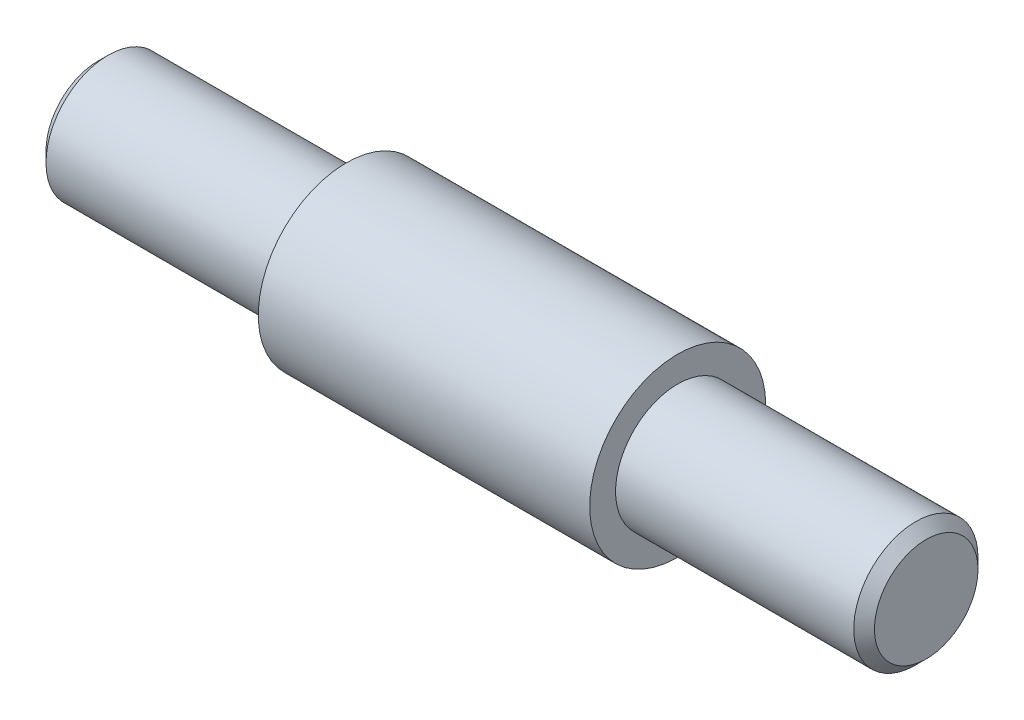
ISO-10303-21;
HEADER;
FILE_DESCRIPTION(('STEP AP214'),'2;1');
FILE_NAME('part.step','',(''),(''),'','','');
FILE_SCHEMA(('AUTOMOTIVE_DESIGN { 1 0 10303 214 1 1 1 1 }'));
ENDSEC;
DATA;
#1=APPLICATION_CONTEXT('core data for automotive mechanical design processes');
#2=APPLICATION_PROTOCOL_DEFINITION('international standard','automotive_design',2000,#1);
#3=PRODUCT_CONTEXT('',#1,'mechanical');
#4=PRODUCT('Part','Part','',(#3));
#5=PRODUCT_RELATED_PRODUCT_CATEGORY('part','',(#4));
#6=PRODUCT_DEFINITION_FORMATION('','',#4);
#7=PRODUCT_DEFINITION_CONTEXT('part definition',#1,'design');
#8=PRODUCT_DEFINITION('design','',#6,#7);
#9=PRODUCT_DEFINITION_SHAPE('','',#8);
#10=(LENGTH_UNIT() NAMED_UNIT(*) SI_UNIT(.MILLI.,.METRE.));
#11=(NAMED_UNIT(*) PLANE_ANGLE_UNIT() SI_UNIT($,.RADIAN.));
#12=(NAMED_UNIT(*) SI_UNIT($,.STERADIAN.) SOLID_ANGLE_UNIT());
#13=UNCERTAINTY_MEASURE_WITH_UNIT(LENGTH_MEASURE(1.E-05),#10,'distance_accuracy_value','');
#14=(GEOMETRIC_REPRESENTATION_CONTEXT(3) GLOBAL_UNCERTAINTY_ASSIGNED_CONTEXT((#13)) GLOBAL_UNIT_ASSIGNED_CONTEXT((#10,
#11,#12)) REPRESENTATION_CONTEXT('',''));
#15=CARTESIAN_POINT('',(0.,0.,0.));
#16=DIRECTION('',(0.,0.,1.));
#17=DIRECTION('',(1.,0.,0.));
#18=AXIS2_PLACEMENT_3D('',#15,#16,#17);
#19=CARTESIAN_POINT('',(20.,0.,0.));
#20=DIRECTION('',(1.,0.,0.));
#21=DIRECTION('',(0.,0.,-1.));
#22=AXIS2_PLACEMENT_3D('',#19,#20,#21);
#23=PLANE('',#22);
#24=CARTESIAN_POINT('',(20.,0.,0.));
#25=DIRECTION('',(1.,0.,0.));
#26=DIRECTION('',(0.,0.,-1.));
#27=AXIS2_PLACEMENT_3D('',#24,#25,#26);
#28=CIRCLE('',#27,2.5);
#29=CARTESIAN_POINT('',(20.,0.,-2.5));
#30=VERTEX_POINT('',#29);
#31=EDGE_CURVE('E42',#30,#30,#28,.T.);
#32=ORIENTED_EDGE('',*,*,#31,.T.);
#33=EDGE_LOOP('',(#32));
#34=FACE_BOUND('',#33,.T.);
#35=ADVANCED_FACE('F34',(#34),#23,.T.);
#36=CARTESIAN_POINT('',(0.,0.,0.));
#37=DIRECTION('',(1.,0.,0.));
#38=DIRECTION('',(0.,0.,-1.));
#39=AXIS2_PLACEMENT_3D('',#36,#37,#38);
#40=CYLINDRICAL_SURFACE('',#39,3.);
#41=CARTESIAN_POINT('',(19.5,0.,0.));
#42=DIRECTION('',(1.,0.,0.));
#43=DIRECTION('',(0.,0.,-1.));
#44=AXIS2_PLACEMENT_3D('',#41,#42,#43);
#45=CIRCLE('',#44,3.);
#46=CARTESIAN_POINT('',(19.5,0.,-3.));
#47=VERTEX_POINT('',#46);
#48=EDGE_CURVE('E10',#47,#47,#45,.F.);
#49=ORIENTED_EDGE('',*,*,#48,.T.);
#50=EDGE_LOOP('',(#49));
#51=FACE_BOUND('',#50,.T.);
#52=CARTESIAN_POINT('',(8.,0.,0.));
#53=DIRECTION('',(1.,0.,0.));
#54=DIRECTION('',(0.,0.,-1.));
#55=AXIS2_PLACEMENT_3D('',#52,#53,#54);
#56=CIRCLE('',#55,3.);
#57=CARTESIAN_POINT('',(8.,0.,-3.));
#58=VERTEX_POINT('',#57);
#59=EDGE_CURVE('E55',#58,#58,#56,.T.);
#60=ORIENTED_EDGE('',*,*,#59,.T.);
#61=EDGE_LOOP('',(#60));
#62=FACE_BOUND('',#61,.T.);
#63=ADVANCED_FACE('F86',(#51,#62),#40,.T.);
#64=CARTESIAN_POINT('',(8.,3.,0.));
#65=DIRECTION('',(1.,0.,0.));
#66=DIRECTION('',(0.,0.,-1.));
#67=AXIS2_PLACEMENT_3D('',#64,#65,#66);
#68=PLANE('',#67);
#69=CARTESIAN_POINT('',(8.,0.,0.));
#70=DIRECTION('',(1.,0.,0.));
#71=DIRECTION('',(0.,0.,-1.));
#72=AXIS2_PLACEMENT_3D('',#69,#70,#71);
#73=CIRCLE('',#72,4.25);
#74=CARTESIAN_POINT('',(8.,0.,-4.25));
#75=VERTEX_POINT('',#74);
#76=EDGE_CURVE('E58',#75,#75,#73,.T.);
#77=ORIENTED_EDGE('',*,*,#76,.T.);
#78=EDGE_LOOP('',(#77));
#79=FACE_BOUND('',#78,.T.);
#80=ORIENTED_EDGE('',*,*,#59,.F.);
#81=EDGE_LOOP('',(#80));
#82=FACE_BOUND('',#81,.T.);
#83=ADVANCED_FACE('F91',(#79,#82),#68,.T.);
#84=CARTESIAN_POINT('',(0.,0.,0.));
#85=DIRECTION('',(1.,0.,0.));
#86=DIRECTION('',(0.,0.,-1.));
#87=AXIS2_PLACEMENT_3D('',#84,#85,#86);
#88=CYLINDRICAL_SURFACE('',#87,4.25);
#89=CARTESIAN_POINT('',(-8.,0.,0.));
#90=DIRECTION('',(1.,0.,0.));
#91=DIRECTION('',(0.,0.,-1.));
#92=AXIS2_PLACEMENT_3D('',#89,#90,#91);
#93=CIRCLE('',#92,4.25);
#94=CARTESIAN_POINT('',(-8.,0.,-4.25));
#95=VERTEX_POINT('',#94);
#96=EDGE_CURVE('E61',#95,#95,#93,.T.);
#97=ORIENTED_EDGE('',*,*,#96,.T.);
#98=EDGE_LOOP('',(#97));
#99=FACE_BOUND('',#98,.T.);
#100=ORIENTED_EDGE('',*,*,#76,.F.);
#101=EDGE_LOOP('',(#100));
#102=FACE_BOUND('',#101,.T.);
#103=ADVANCED_FACE('F83',(#99,#102),#88,.T.);
#104=CARTESIAN_POINT('',(-8.,4.25,0.));
#105=DIRECTION('',(-1.,0.,0.));
#106=DIRECTION('',(0.,0.,1.));
#107=AXIS2_PLACEMENT_3D('',#104,#105,#106);
#108=PLANE('',#107);
#109=CARTESIAN_POINT('',(-8.,0.,0.));
#110=DIRECTION('',(1.,0.,0.));
#111=DIRECTION('',(0.,0.,-1.));
#112=AXIS2_PLACEMENT_3D('',#109,#110,#111);
#113=CIRCLE('',#112,3.);
#114=CARTESIAN_POINT('',(-8.,0.,-3.));
#115=VERTEX_POINT('',#114);
#116=EDGE_CURVE('E64',#115,#115,#113,.T.);
#117=ORIENTED_EDGE('',*,*,#116,.T.);
#118=EDGE_LOOP('',(#117));
#119=FACE_BOUND('',#118,.T.);
#120=ORIENTED_EDGE('',*,*,#96,.F.);
#121=EDGE_LOOP('',(#120));
#122=FACE_BOUND('',#121,.T.);
#123=ADVANCED_FACE('F68',(#119,#122),#108,.T.);
#124=CARTESIAN_POINT('',(0.,0.,0.));
#125=DIRECTION('',(1.,0.,0.));
#126=DIRECTION('',(0.,0.,-1.));
#127=AXIS2_PLACEMENT_3D('',#124,#125,#126);
#128=CYLINDRICAL_SURFACE('',#127,3.);
#129=CARTESIAN_POINT('',(-19.5,0.,0.));
#130=DIRECTION('',(-1.,0.,0.));
#131=DIRECTION('',(0.,0.,1.));
#132=AXIS2_PLACEMENT_3D('',#129,#130,#131);
#133=CIRCLE('',#132,3.);
#134=CARTESIAN_POINT('',(-19.5,0.,3.));
#135=VERTEX_POINT('',#134);
#136=EDGE_CURVE('E50',#135,#135,#133,.F.);
#137=ORIENTED_EDGE('',*,*,#136,.T.);
#138=EDGE_LOOP('',(#137));
#139=FACE_BOUND('',#138,.T.);
#140=ORIENTED_EDGE('',*,*,#116,.F.);
#141=EDGE_LOOP('',(#140));
#142=FACE_BOUND('',#141,.T.);
#143=ADVANCED_FACE('F71',(#139,#142),#128,.T.);
#144=CARTESIAN_POINT('',(-20.,3.,0.));
#145=DIRECTION('',(-1.,0.,0.));
#146=DIRECTION('',(0.,0.,1.));
#147=AXIS2_PLACEMENT_3D('',#144,#145,#146);
#148=PLANE('',#147);
#149=CARTESIAN_POINT('',(-20.,0.,0.));
#150=DIRECTION('',(-1.,0.,0.));
#151=DIRECTION('',(0.,0.,1.));
#152=AXIS2_PLACEMENT_3D('',#149,#150,#151);
#153=CIRCLE('',#152,2.5);
#154=CARTESIAN_POINT('',(-20.,0.,2.5));
#155=VERTEX_POINT('',#154);
#156=EDGE_CURVE('E46',#155,#155,#153,.T.);
#157=ORIENTED_EDGE('',*,*,#156,.T.);
#158=EDGE_LOOP('',(#157));
#159=FACE_BOUND('',#158,.T.);
#160=ADVANCED_FACE('F73',(#159),#148,.T.);
#161=CARTESIAN_POINT('',(-19.5,0.,0.));
#162=DIRECTION('',(1.,0.,0.));
#163=DIRECTION('',(0.,0.,-1.));
#164=AXIS2_PLACEMENT_3D('',#161,#162,#163);
#165=CONICAL_SURFACE('',#164,3.,0.785398163397454);
#166=ORIENTED_EDGE('',*,*,#156,.F.);
#167=EDGE_LOOP('',(#166));
#168=FACE_BOUND('',#167,.T.);
#169=ORIENTED_EDGE('',*,*,#136,.F.);
#170=EDGE_LOOP('',(#169));
#171=FACE_BOUND('',#170,.T.);
#172=ADVANCED_FACE('F80',(#168,#171),#165,.T.);
#173=CARTESIAN_POINT('',(20.,0.,0.));
#174=DIRECTION('',(-1.,0.,0.));
#175=DIRECTION('',(0.,0.,1.));
#176=AXIS2_PLACEMENT_3D('',#173,#174,#175);
#177=CONICAL_SURFACE('',#176,2.5,0.785398163397444);
#178=ORIENTED_EDGE('',*,*,#48,.F.);
#179=EDGE_LOOP('',(#178));
#180=FACE_BOUND('',#179,.T.);
#181=ORIENTED_EDGE('',*,*,#31,.F.);
#182=EDGE_LOOP('',(#181));
#183=FACE_BOUND('',#182,.T.);
#184=ADVANCED_FACE('F37',(#180,#183),#177,.T.);
#185=CLOSED_SHELL('',(#35,#63,#83,#103,#123,#143,#160,#172,#184));
#186=MANIFOLD_SOLID_BREP('B2',#185);
#187=ADVANCED_BREP_SHAPE_REPRESENTATION('',(#18,#186),#14);
#188=SHAPE_DEFINITION_REPRESENTATION(#9,#187);
ENDSEC;
END-ISO-10303-21;
